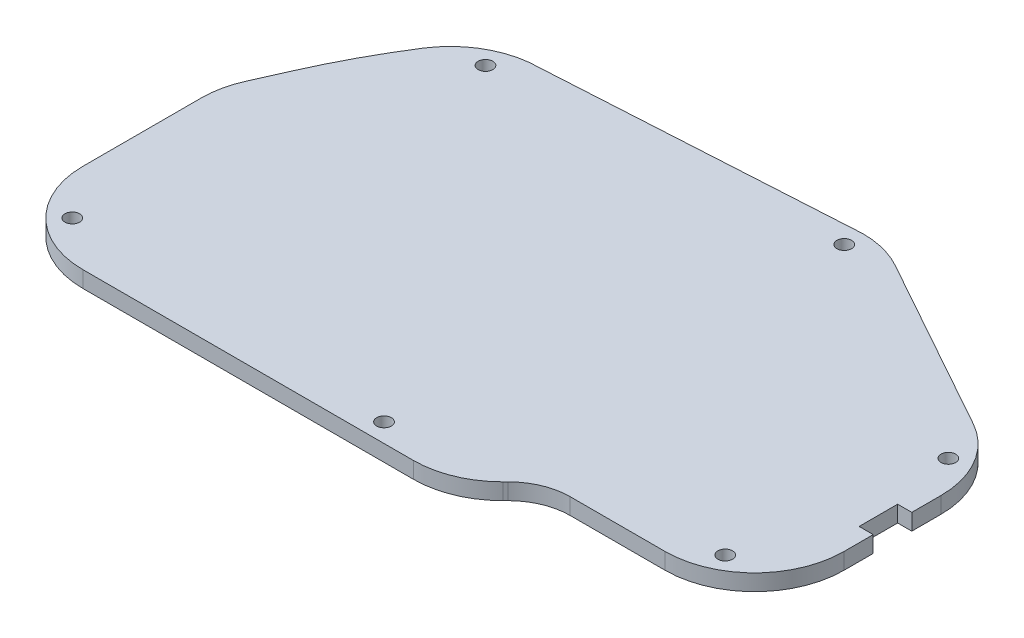
ISO-10303-21;
HEADER;
FILE_DESCRIPTION(('STEP AP214'),'2;1');
FILE_NAME('part.step','',(''),(''),'','','');
FILE_SCHEMA(('AUTOMOTIVE_DESIGN { 1 0 10303 214 1 1 1 1 }'));
ENDSEC;
DATA;
#1=APPLICATION_CONTEXT('core data for automotive mechanical design processes');
#2=APPLICATION_PROTOCOL_DEFINITION('international standard','automotive_design',2000,#1);
#3=PRODUCT_CONTEXT('',#1,'mechanical');
#4=PRODUCT('Part','Part','',(#3));
#5=PRODUCT_RELATED_PRODUCT_CATEGORY('part','',(#4));
#6=PRODUCT_DEFINITION_FORMATION('','',#4);
#7=PRODUCT_DEFINITION_CONTEXT('part definition',#1,'design');
#8=PRODUCT_DEFINITION('design','',#6,#7);
#9=PRODUCT_DEFINITION_SHAPE('','',#8);
#10=(LENGTH_UNIT() NAMED_UNIT(*) SI_UNIT(.MILLI.,.METRE.));
#11=(NAMED_UNIT(*) PLANE_ANGLE_UNIT() SI_UNIT($,.RADIAN.));
#12=(NAMED_UNIT(*) SI_UNIT($,.STERADIAN.) SOLID_ANGLE_UNIT());
#13=UNCERTAINTY_MEASURE_WITH_UNIT(LENGTH_MEASURE(1.E-05),#10,'distance_accuracy_value','');
#14=(GEOMETRIC_REPRESENTATION_CONTEXT(3) GLOBAL_UNCERTAINTY_ASSIGNED_CONTEXT((#13)) GLOBAL_UNIT_ASSIGNED_CONTEXT((#10,
#11,#12)) REPRESENTATION_CONTEXT('',''));
#15=CARTESIAN_POINT('',(0.,0.,0.));
#16=DIRECTION('',(0.,0.,1.));
#17=DIRECTION('',(1.,0.,0.));
#18=AXIS2_PLACEMENT_3D('',#15,#16,#17);
#19=CARTESIAN_POINT('',(-153.649556898131,3.175,60.0820712296482));
#20=DIRECTION('',(0.,1.,0.));
#21=DIRECTION('',(0.,0.,1.));
#22=AXIS2_PLACEMENT_3D('',#19,#20,#21);
#23=PLANE('',#22);
#24=CARTESIAN_POINT('',(-267.548354841244,3.175,97.8527285220219));
#25=DIRECTION('',(0.,1.,0.));
#26=DIRECTION('',(0.,0.,1.));
#27=AXIS2_PLACEMENT_3D('',#24,#25,#26);
#28=CIRCLE('',#27,1.42499999999999);
#29=CARTESIAN_POINT('',(-267.548354841244,3.175,99.2777285220219));
#30=VERTEX_POINT('',#29);
#31=EDGE_CURVE('E418',#30,#30,#28,.T.);
#32=ORIENTED_EDGE('',*,*,#31,.F.);
#33=EDGE_LOOP('',(#32));
#34=FACE_BOUND('',#33,.T.);
#35=CARTESIAN_POINT('',(-187.963906245359,3.175,27.219493821026));
#36=DIRECTION('',(0.,1.,0.));
#37=DIRECTION('',(0.,0.,1.));
#38=AXIS2_PLACEMENT_3D('',#35,#36,#37);
#39=CIRCLE('',#38,1.42500000000002);
#40=CARTESIAN_POINT('',(-187.963906245359,3.175,28.644493821026));
#41=VERTEX_POINT('',#40);
#42=EDGE_CURVE('E430',#41,#41,#39,.T.);
#43=ORIENTED_EDGE('',*,*,#42,.F.);
#44=EDGE_LOOP('',(#43));
#45=FACE_BOUND('',#44,.T.);
#46=CARTESIAN_POINT('',(-147.207602144608,3.175,91.1272884977668));
#47=DIRECTION('',(0.,1.,0.));
#48=DIRECTION('',(0.,0.,1.));
#49=AXIS2_PLACEMENT_3D('',#46,#47,#48);
#50=CIRCLE('',#49,1.42500000000002);
#51=CARTESIAN_POINT('',(-147.207602144608,3.175,92.5522884977668));
#52=VERTEX_POINT('',#51);
#53=EDGE_CURVE('E214',#52,#52,#50,.T.);
#54=ORIENTED_EDGE('',*,*,#53,.F.);
#55=EDGE_LOOP('',(#54));
#56=FACE_BOUND('',#55,.T.);
#57=CARTESIAN_POINT('',(-153.649556898131,3.175,60.0820712296482));
#58=DIRECTION('',(0.,1.,0.));
#59=DIRECTION('',(0.,0.,1.));
#60=AXIS2_PLACEMENT_3D('',#57,#58,#59);
#61=CIRCLE('',#60,17.3999999999996);
#62=CARTESIAN_POINT('',(-136.249556898132,3.175,60.0820712296497));
#63=VERTEX_POINT('',#62);
#64=CARTESIAN_POINT('',(-145.182770750242,3.175,44.8809682326312));
#65=VERTEX_POINT('',#64);
#66=EDGE_CURVE('E251',#63,#65,#61,.T.);
#67=ORIENTED_EDGE('',*,*,#66,.T.);
#68=DIRECTION('',(-0.873626609023966,0.,-0.486596905051077));
#69=VECTOR('',#68,1.);
#70=CARTESIAN_POINT('',(-145.182770750242,3.175,44.8809682326312));
#71=LINE('',#70,#69);
#72=CARTESIAN_POINT('',(-179.49712009747,3.175,25.768390824009));
#73=VERTEX_POINT('',#72);
#74=EDGE_CURVE('E134',#65,#73,#71,.T.);
#75=ORIENTED_EDGE('',*,*,#74,.T.);
#76=CARTESIAN_POINT('',(-187.963906245359,3.175,40.9694938210259));
#77=DIRECTION('',(0.,1.,0.));
#78=DIRECTION('',(0.,0.,1.));
#79=AXIS2_PLACEMENT_3D('',#76,#77,#78);
#80=CIRCLE('',#79,17.4);
#81=CARTESIAN_POINT('',(-187.960968922476,3.175,23.5694940689531));
#82=VERTEX_POINT('',#81);
#83=EDGE_CURVE('E305',#73,#82,#80,.T.);
#84=ORIENTED_EDGE('',*,*,#83,.T.);
#85=DIRECTION('',(-0.99827097221074,0.,0.058779809811052));
#86=VECTOR('',#85,1.);
#87=CARTESIAN_POINT('',(-187.960968922476,3.175,23.5694940689531));
#88=LINE('',#87,#86);
#89=CARTESIAN_POINT('',(-247.377604545257,3.175,27.0680416965429));
#90=VERTEX_POINT('',#89);
#91=EDGE_CURVE('E324',#82,#90,#88,.T.);
#92=ORIENTED_EDGE('',*,*,#91,.T.);
#93=CARTESIAN_POINT('',(-247.380541868139,3.175,44.4680414486157));
#94=DIRECTION('',(0.,1.,0.));
#95=DIRECTION('',(0.,0.,1.));
#96=AXIS2_PLACEMENT_3D('',#93,#94,#95);
#97=CIRCLE('',#96,17.4);
#98=CARTESIAN_POINT('',(-262.070326039549,3.175,35.1422577819519));
#99=VERTEX_POINT('',#98);
#100=EDGE_CURVE('E321',#90,#99,#97,.T.);
#101=ORIENTED_EDGE('',*,*,#100,.T.);
#102=CARTESIAN_POINT('',(-154.715336031883,3.175,103.29638453195));
#103=DIRECTION('',(0.,1.,0.));
#104=DIRECTION('',(0.,0.,1.));
#105=AXIS2_PLACEMENT_3D('',#102,#103,#104);
#106=CIRCLE('',#105,127.161624999844);
#107=CARTESIAN_POINT('',(-270.933745897009,3.175,51.6886323911874));
#108=VERTEX_POINT('',#107);
#109=EDGE_CURVE('E323',#99,#108,#106,.T.);
#110=ORIENTED_EDGE('',*,*,#109,.T.);
#111=DIRECTION('',(-0.405843760968183,0.,0.913942471758043));
#112=VECTOR('',#111,1.);
#113=CARTESIAN_POINT('',(-270.933745897009,3.175,51.6886323911874));
#114=LINE('',#113,#112);
#115=CARTESIAN_POINT('',(-273.728235608519,3.175,57.9817014977483));
#116=VERTEX_POINT('',#115);
#117=EDGE_CURVE('E326',#108,#116,#114,.T.);
#118=ORIENTED_EDGE('',*,*,#117,.T.);
#119=CARTESIAN_POINT('',(-257.825636599929,3.175,65.0433829385948));
#120=DIRECTION('',(0.,1.,0.));
#121=DIRECTION('',(0.,0.,1.));
#122=AXIS2_PLACEMENT_3D('',#119,#120,#121);
#123=CIRCLE('',#122,17.4);
#124=CARTESIAN_POINT('',(-275.225636599929,3.175,65.0433829385949));
#125=VERTEX_POINT('',#124);
#126=EDGE_CURVE('E332',#116,#125,#123,.T.);
#127=ORIENTED_EDGE('',*,*,#126,.T.);
#128=DIRECTION('',(0.,0.,1.));
#129=VECTOR('',#128,1.);
#130=CARTESIAN_POINT('',(-275.225636599929,3.175,65.0433829385949));
#131=LINE('',#130,#129);
#132=CARTESIAN_POINT('',(-275.225636599929,3.175,88.1300102807068));
#133=VERTEX_POINT('',#132);
#134=EDGE_CURVE('E334',#125,#133,#131,.T.);
#135=ORIENTED_EDGE('',*,*,#134,.T.);
#136=CARTESIAN_POINT('',(-257.825636599929,3.175,88.130010280707));
#137=DIRECTION('',(0.,1.,0.));
#138=DIRECTION('',(0.,0.,1.));
#139=AXIS2_PLACEMENT_3D('',#136,#137,#138);
#140=CIRCLE('',#139,17.4);
#141=CARTESIAN_POINT('',(-257.825636599929,3.175,105.530010280707));
#142=VERTEX_POINT('',#141);
#143=EDGE_CURVE('E336',#133,#142,#140,.T.);
#144=ORIENTED_EDGE('',*,*,#143,.T.);
#145=DIRECTION('',(1.,0.,0.));
#146=VECTOR('',#145,1.);
#147=CARTESIAN_POINT('',(-257.825636599926,3.175,105.530010280707));
#148=LINE('',#147,#146);
#149=CARTESIAN_POINT('',(-193.494425739186,3.175,105.530010280707));
#150=VERTEX_POINT('',#149);
#151=EDGE_CURVE('E338',#142,#150,#148,.T.);
#152=ORIENTED_EDGE('',*,*,#151,.T.);
#153=CARTESIAN_POINT('',(-193.494425739186,3.175,88.130010280707));
#154=DIRECTION('',(0.,1.,0.));
#155=DIRECTION('',(0.,0.,1.));
#156=AXIS2_PLACEMENT_3D('',#153,#154,#155);
#157=CIRCLE('',#156,17.4);
#158=CARTESIAN_POINT('',(-181.19076774654,3.175,100.433668273353));
#159=VERTEX_POINT('',#158);
#160=EDGE_CURVE('E340',#150,#159,#157,.T.);
#161=ORIENTED_EDGE('',*,*,#160,.T.);
#162=DIRECTION('',(0.707106781186557,0.,-0.707106781186538));
#163=VECTOR('',#162,1.);
#164=CARTESIAN_POINT('',(-181.19076774654,3.175,100.433668273353));
#165=LINE('',#164,#163);
#166=CARTESIAN_POINT('',(-180.680815132551,3.175,99.9237156593637));
#167=VERTEX_POINT('',#166);
#168=EDGE_CURVE('E342',#159,#167,#165,.T.);
#169=ORIENTED_EDGE('',*,*,#168,.T.);
#170=CARTESIAN_POINT('',(-172.124823080193,3.175,108.479707711721));
#171=DIRECTION('',(0.,-1.,0.));
#172=DIRECTION('',(0.,0.,1.));
#173=AXIS2_PLACEMENT_3D('',#170,#171,#172);
#174=CIRCLE('',#173,12.1);
#175=CARTESIAN_POINT('',(-172.124823080193,3.175,96.3797077117209));
#176=VERTEX_POINT('',#175);
#177=EDGE_CURVE('E344',#167,#176,#174,.T.);
#178=ORIENTED_EDGE('',*,*,#177,.T.);
#179=DIRECTION('',(1.,0.,0.));
#180=VECTOR('',#179,1.);
#181=CARTESIAN_POINT('',(-172.124823080193,3.175,96.3797077117209));
#182=LINE('',#181,#180);
#183=CARTESIAN_POINT('',(-153.649556898133,3.175,96.3797077117209));
#184=VERTEX_POINT('',#183);
#185=EDGE_CURVE('E346',#176,#184,#182,.T.);
#186=ORIENTED_EDGE('',*,*,#185,.T.);
#187=CARTESIAN_POINT('',(-153.649556898131,3.175,78.9797077117209));
#188=DIRECTION('',(0.,1.,0.));
#189=DIRECTION('',(0.,0.,1.));
#190=AXIS2_PLACEMENT_3D('',#187,#188,#189);
#191=CIRCLE('',#190,17.3999999999998);
#192=CARTESIAN_POINT('',(-136.249556898131,3.175,78.9797077117217));
#193=VERTEX_POINT('',#192);
#194=EDGE_CURVE('E348',#184,#193,#191,.T.);
#195=ORIENTED_EDGE('',*,*,#194,.T.);
#196=DIRECTION('',(0.,0.,-1.));
#197=VECTOR('',#196,1.);
#198=CARTESIAN_POINT('',(-136.249556898131,3.175,78.9797077117217));
#199=LINE('',#198,#197);
#200=CARTESIAN_POINT('',(-136.249556898131,3.175,73.2808894706851));
#201=VERTEX_POINT('',#200);
#202=EDGE_CURVE('E350',#193,#201,#199,.T.);
#203=ORIENTED_EDGE('',*,*,#202,.T.);
#204=DIRECTION('',(-1.,0.,0.));
#205=VECTOR('',#204,1.);
#206=CARTESIAN_POINT('',(-138.999556898131,3.175,73.2808894706851));
#207=LINE('',#206,#205);
#208=CARTESIAN_POINT('',(-138.999556898131,3.175,73.2808894706851));
#209=VERTEX_POINT('',#208);
#210=EDGE_CURVE('E192',#201,#209,#207,.T.);
#211=ORIENTED_EDGE('',*,*,#210,.T.);
#212=DIRECTION('',(0.,0.,-1.));
#213=VECTOR('',#212,1.);
#214=CARTESIAN_POINT('',(-138.999556898131,3.175,65.7808894706851));
#215=LINE('',#214,#213);
#216=CARTESIAN_POINT('',(-138.999556898131,3.175,65.7808894706851));
#217=VERTEX_POINT('',#216);
#218=EDGE_CURVE('E186',#209,#217,#215,.T.);
#219=ORIENTED_EDGE('',*,*,#218,.T.);
#220=DIRECTION('',(1.,0.,0.));
#221=VECTOR('',#220,1.);
#222=CARTESIAN_POINT('',(-138.999556898131,3.175,65.7808894706851));
#223=LINE('',#222,#221);
#224=CARTESIAN_POINT('',(-136.249556898131,3.175,65.7808894706851));
#225=VERTEX_POINT('',#224);
#226=EDGE_CURVE('E190',#217,#225,#223,.T.);
#227=ORIENTED_EDGE('',*,*,#226,.T.);
#228=DIRECTION('',(0.,0.,-1.));
#229=VECTOR('',#228,1.);
#230=CARTESIAN_POINT('',(-136.249556898131,3.175,65.7808894706851));
#231=LINE('',#230,#229);
#232=EDGE_CURVE('E52',#225,#63,#231,.T.);
#233=ORIENTED_EDGE('',*,*,#232,.T.);
#234=EDGE_LOOP('',(#67,#75,#84,#92,#101,#110,#118,#127,#135,#144,#152,#161,#169,#178,#186,#195,
#203,#211,#219,#227,#233));
#235=FACE_BOUND('',#234,.T.);
#236=CARTESIAN_POINT('',(-141.795027650598,3.175,53.1155343339314));
#237=DIRECTION('',(0.,1.,0.));
#238=DIRECTION('',(0.,0.,1.));
#239=AXIS2_PLACEMENT_3D('',#236,#237,#238);
#240=CIRCLE('',#239,1.42500000000002);
#241=CARTESIAN_POINT('',(-141.795027650598,3.175,54.5405343339314));
#242=VERTEX_POINT('',#241);
#243=EDGE_CURVE('E436',#242,#242,#240,.T.);
#244=ORIENTED_EDGE('',*,*,#243,.F.);
#245=EDGE_LOOP('',(#244));
#246=FACE_BOUND('',#245,.T.);
#247=CARTESIAN_POINT('',(-253.051529835332,3.175,31.9419728125291));
#248=DIRECTION('',(0.,1.,0.));
#249=DIRECTION('',(0.,0.,1.));
#250=AXIS2_PLACEMENT_3D('',#247,#248,#249);
#251=CIRCLE('',#250,1.42499999999999);
#252=CARTESIAN_POINT('',(-253.051529835332,3.175,33.3669728125291));
#253=VERTEX_POINT('',#252);
#254=EDGE_CURVE('E424',#253,#253,#251,.T.);
#255=ORIENTED_EDGE('',*,*,#254,.F.);
#256=EDGE_LOOP('',(#255));
#257=FACE_BOUND('',#256,.T.);
#258=CARTESIAN_POINT('',(-202.85468143992,3.175,101.880010280707));
#259=DIRECTION('',(0.,1.,0.));
#260=DIRECTION('',(0.,0.,1.));
#261=AXIS2_PLACEMENT_3D('',#258,#259,#260);
#262=CIRCLE('',#261,1.42500000000002);
#263=CARTESIAN_POINT('',(-202.85468143992,3.175,103.305010280707));
#264=VERTEX_POINT('',#263);
#265=EDGE_CURVE('E409',#264,#264,#262,.T.);
#266=ORIENTED_EDGE('',*,*,#265,.F.);
#267=EDGE_LOOP('',(#266));
#268=FACE_BOUND('',#267,.T.);
#269=ADVANCED_FACE('F35',(#34,#45,#56,#235,#246,#257,#268),#23,.T.);
#270=CARTESIAN_POINT('',(-153.649556898131,0.,60.0820712296482));
#271=DIRECTION('',(0.,1.,0.));
#272=DIRECTION('',(0.,0.,1.));
#273=AXIS2_PLACEMENT_3D('',#270,#271,#272);
#274=PLANE('',#273);
#275=CARTESIAN_POINT('',(-153.649556898131,0.,60.0820712296482));
#276=DIRECTION('',(0.,1.,0.));
#277=DIRECTION('',(0.,0.,1.));
#278=AXIS2_PLACEMENT_3D('',#275,#276,#277);
#279=CIRCLE('',#278,17.3999999999996);
#280=CARTESIAN_POINT('',(-136.249556898132,0.,60.0820712296497));
#281=VERTEX_POINT('',#280);
#282=CARTESIAN_POINT('',(-145.182770750242,0.,44.8809682326312));
#283=VERTEX_POINT('',#282);
#284=EDGE_CURVE('E210',#281,#283,#279,.T.);
#285=ORIENTED_EDGE('',*,*,#284,.F.);
#286=DIRECTION('',(0.,0.,-1.));
#287=VECTOR('',#286,1.);
#288=CARTESIAN_POINT('',(-136.249556898131,0.,65.7808894706851));
#289=LINE('',#288,#287);
#290=CARTESIAN_POINT('',(-136.249556898131,0.,65.7808894706851));
#291=VERTEX_POINT('',#290);
#292=EDGE_CURVE('E126',#291,#281,#289,.T.);
#293=ORIENTED_EDGE('',*,*,#292,.F.);
#294=DIRECTION('',(1.,0.,0.));
#295=VECTOR('',#294,1.);
#296=CARTESIAN_POINT('',(-138.999556898131,0.,65.7808894706851));
#297=LINE('',#296,#295);
#298=CARTESIAN_POINT('',(-138.999556898131,0.,65.7808894706851));
#299=VERTEX_POINT('',#298);
#300=EDGE_CURVE('E120',#299,#291,#297,.T.);
#301=ORIENTED_EDGE('',*,*,#300,.F.);
#302=DIRECTION('',(0.,0.,-1.));
#303=VECTOR('',#302,1.);
#304=CARTESIAN_POINT('',(-138.999556898131,0.,65.7808894706851));
#305=LINE('',#304,#303);
#306=CARTESIAN_POINT('',(-138.999556898131,0.,73.2808894706851));
#307=VERTEX_POINT('',#306);
#308=EDGE_CURVE('E200',#307,#299,#305,.T.);
#309=ORIENTED_EDGE('',*,*,#308,.F.);
#310=DIRECTION('',(-1.,0.,0.));
#311=VECTOR('',#310,1.);
#312=CARTESIAN_POINT('',(-138.999556898131,0.,73.2808894706851));
#313=LINE('',#312,#311);
#314=CARTESIAN_POINT('',(-136.249556898131,0.,73.2808894706851));
#315=VERTEX_POINT('',#314);
#316=EDGE_CURVE('E246',#315,#307,#313,.T.);
#317=ORIENTED_EDGE('',*,*,#316,.F.);
#318=DIRECTION('',(0.,0.,-1.));
#319=VECTOR('',#318,1.);
#320=CARTESIAN_POINT('',(-136.249556898131,0.,78.9797077117217));
#321=LINE('',#320,#319);
#322=CARTESIAN_POINT('',(-136.249556898131,0.,78.9797077117217));
#323=VERTEX_POINT('',#322);
#324=EDGE_CURVE('E244',#323,#315,#321,.T.);
#325=ORIENTED_EDGE('',*,*,#324,.F.);
#326=CARTESIAN_POINT('',(-153.649556898131,0.,78.9797077117209));
#327=DIRECTION('',(0.,1.,0.));
#328=DIRECTION('',(0.,0.,1.));
#329=AXIS2_PLACEMENT_3D('',#326,#327,#328);
#330=CIRCLE('',#329,17.3999999999998);
#331=CARTESIAN_POINT('',(-153.649556898133,0.,96.3797077117209));
#332=VERTEX_POINT('',#331);
#333=EDGE_CURVE('E242',#332,#323,#330,.T.);
#334=ORIENTED_EDGE('',*,*,#333,.F.);
#335=DIRECTION('',(1.,0.,0.));
#336=VECTOR('',#335,1.);
#337=CARTESIAN_POINT('',(-172.124823080193,0.,96.3797077117209));
#338=LINE('',#337,#336);
#339=CARTESIAN_POINT('',(-172.124823080193,0.,96.3797077117209));
#340=VERTEX_POINT('',#339);
#341=EDGE_CURVE('E240',#340,#332,#338,.T.);
#342=ORIENTED_EDGE('',*,*,#341,.F.);
#343=CARTESIAN_POINT('',(-172.124823080193,0.,108.479707711721));
#344=DIRECTION('',(0.,-1.,0.));
#345=DIRECTION('',(0.,0.,1.));
#346=AXIS2_PLACEMENT_3D('',#343,#344,#345);
#347=CIRCLE('',#346,12.1);
#348=CARTESIAN_POINT('',(-180.680815132551,0.,99.9237156593637));
#349=VERTEX_POINT('',#348);
#350=EDGE_CURVE('E238',#349,#340,#347,.T.);
#351=ORIENTED_EDGE('',*,*,#350,.F.);
#352=DIRECTION('',(0.707106781186557,0.,-0.707106781186538));
#353=VECTOR('',#352,1.);
#354=CARTESIAN_POINT('',(-181.19076774654,0.,100.433668273353));
#355=LINE('',#354,#353);
#356=CARTESIAN_POINT('',(-181.19076774654,0.,100.433668273353));
#357=VERTEX_POINT('',#356);
#358=EDGE_CURVE('E236',#357,#349,#355,.T.);
#359=ORIENTED_EDGE('',*,*,#358,.F.);
#360=CARTESIAN_POINT('',(-193.494425739186,0.,88.130010280707));
#361=DIRECTION('',(0.,1.,0.));
#362=DIRECTION('',(0.,0.,1.));
#363=AXIS2_PLACEMENT_3D('',#360,#361,#362);
#364=CIRCLE('',#363,17.4);
#365=CARTESIAN_POINT('',(-193.494425739186,0.,105.530010280707));
#366=VERTEX_POINT('',#365);
#367=EDGE_CURVE('E234',#366,#357,#364,.T.);
#368=ORIENTED_EDGE('',*,*,#367,.F.);
#369=DIRECTION('',(1.,0.,0.));
#370=VECTOR('',#369,1.);
#371=CARTESIAN_POINT('',(-257.825636599926,0.,105.530010280707));
#372=LINE('',#371,#370);
#373=CARTESIAN_POINT('',(-257.825636599929,0.,105.530010280707));
#374=VERTEX_POINT('',#373);
#375=EDGE_CURVE('E232',#374,#366,#372,.T.);
#376=ORIENTED_EDGE('',*,*,#375,.F.);
#377=CARTESIAN_POINT('',(-257.825636599929,0.,88.130010280707));
#378=DIRECTION('',(0.,1.,0.));
#379=DIRECTION('',(0.,0.,1.));
#380=AXIS2_PLACEMENT_3D('',#377,#378,#379);
#381=CIRCLE('',#380,17.4);
#382=CARTESIAN_POINT('',(-275.225636599929,0.,88.1300102807068));
#383=VERTEX_POINT('',#382);
#384=EDGE_CURVE('E230',#383,#374,#381,.T.);
#385=ORIENTED_EDGE('',*,*,#384,.F.);
#386=DIRECTION('',(0.,0.,1.));
#387=VECTOR('',#386,1.);
#388=CARTESIAN_POINT('',(-275.225636599929,0.,65.0433829385949));
#389=LINE('',#388,#387);
#390=CARTESIAN_POINT('',(-275.225636599929,0.,65.0433829385949));
#391=VERTEX_POINT('',#390);
#392=EDGE_CURVE('E228',#391,#383,#389,.T.);
#393=ORIENTED_EDGE('',*,*,#392,.F.);
#394=CARTESIAN_POINT('',(-257.825636599929,0.,65.0433829385948));
#395=DIRECTION('',(0.,1.,0.));
#396=DIRECTION('',(0.,0.,1.));
#397=AXIS2_PLACEMENT_3D('',#394,#395,#396);
#398=CIRCLE('',#397,17.4);
#399=CARTESIAN_POINT('',(-273.728235608519,0.,57.9817014977483));
#400=VERTEX_POINT('',#399);
#401=EDGE_CURVE('E226',#400,#391,#398,.T.);
#402=ORIENTED_EDGE('',*,*,#401,.F.);
#403=DIRECTION('',(-0.405843760968183,0.,0.913942471758043));
#404=VECTOR('',#403,1.);
#405=CARTESIAN_POINT('',(-270.933745897009,0.,51.6886323911874));
#406=LINE('',#405,#404);
#407=CARTESIAN_POINT('',(-270.933745897009,0.,51.6886323911874));
#408=VERTEX_POINT('',#407);
#409=EDGE_CURVE('E224',#408,#400,#406,.T.);
#410=ORIENTED_EDGE('',*,*,#409,.F.);
#411=CARTESIAN_POINT('',(-154.715336031883,0.,103.29638453195));
#412=DIRECTION('',(0.,1.,0.));
#413=DIRECTION('',(0.,0.,1.));
#414=AXIS2_PLACEMENT_3D('',#411,#412,#413);
#415=CIRCLE('',#414,127.161624999844);
#416=CARTESIAN_POINT('',(-262.070326039549,0.,35.1422577819519));
#417=VERTEX_POINT('',#416);
#418=EDGE_CURVE('E222',#417,#408,#415,.T.);
#419=ORIENTED_EDGE('',*,*,#418,.F.);
#420=CARTESIAN_POINT('',(-247.380541868139,0.,44.4680414486157));
#421=DIRECTION('',(0.,1.,0.));
#422=DIRECTION('',(0.,0.,1.));
#423=AXIS2_PLACEMENT_3D('',#420,#421,#422);
#424=CIRCLE('',#423,17.4);
#425=CARTESIAN_POINT('',(-247.377604545257,0.,27.0680416965429));
#426=VERTEX_POINT('',#425);
#427=EDGE_CURVE('E220',#426,#417,#424,.T.);
#428=ORIENTED_EDGE('',*,*,#427,.F.);
#429=DIRECTION('',(-0.99827097221074,0.,0.058779809811052));
#430=VECTOR('',#429,1.);
#431=CARTESIAN_POINT('',(-187.960968922476,0.,23.5694940689531));
#432=LINE('',#431,#430);
#433=CARTESIAN_POINT('',(-187.960968922476,0.,23.5694940689531));
#434=VERTEX_POINT('',#433);
#435=EDGE_CURVE('E218',#434,#426,#432,.T.);
#436=ORIENTED_EDGE('',*,*,#435,.F.);
#437=CARTESIAN_POINT('',(-187.963906245359,0.,40.9694938210259));
#438=DIRECTION('',(0.,1.,0.));
#439=DIRECTION('',(0.,0.,1.));
#440=AXIS2_PLACEMENT_3D('',#437,#438,#439);
#441=CIRCLE('',#440,17.4);
#442=CARTESIAN_POINT('',(-179.49712009747,0.,25.768390824009));
#443=VERTEX_POINT('',#442);
#444=EDGE_CURVE('E216',#443,#434,#441,.T.);
#445=ORIENTED_EDGE('',*,*,#444,.F.);
#446=DIRECTION('',(-0.873626609023966,0.,-0.486596905051077));
#447=VECTOR('',#446,1.);
#448=CARTESIAN_POINT('',(-145.182770750242,0.,44.8809682326312));
#449=LINE('',#448,#447);
#450=EDGE_CURVE('E213',#283,#443,#449,.T.);
#451=ORIENTED_EDGE('',*,*,#450,.F.);
#452=EDGE_LOOP('',(#285,#293,#301,#309,#317,#325,#334,#342,#351,#359,#368,#376,#385,#393,#402,
#410,#419,#428,#436,#445,#451));
#453=FACE_BOUND('',#452,.T.);
#454=CARTESIAN_POINT('',(-147.207602144608,0.,91.1272884977668));
#455=DIRECTION('',(0.,1.,0.));
#456=DIRECTION('',(0.,0.,1.));
#457=AXIS2_PLACEMENT_3D('',#454,#455,#456);
#458=CIRCLE('',#457,1.42500000000002);
#459=CARTESIAN_POINT('',(-147.207602144608,0.,92.5522884977668));
#460=VERTEX_POINT('',#459);
#461=EDGE_CURVE('E439',#460,#460,#458,.T.);
#462=ORIENTED_EDGE('',*,*,#461,.T.);
#463=EDGE_LOOP('',(#462));
#464=FACE_BOUND('',#463,.T.);
#465=CARTESIAN_POINT('',(-141.795027650598,0.,53.1155343339314));
#466=DIRECTION('',(0.,1.,0.));
#467=DIRECTION('',(0.,0.,1.));
#468=AXIS2_PLACEMENT_3D('',#465,#466,#467);
#469=CIRCLE('',#468,1.42500000000002);
#470=CARTESIAN_POINT('',(-141.795027650598,0.,54.5405343339314));
#471=VERTEX_POINT('',#470);
#472=EDGE_CURVE('E433',#471,#471,#469,.T.);
#473=ORIENTED_EDGE('',*,*,#472,.T.);
#474=EDGE_LOOP('',(#473));
#475=FACE_BOUND('',#474,.T.);
#476=CARTESIAN_POINT('',(-187.963906245359,0.,27.219493821026));
#477=DIRECTION('',(0.,1.,0.));
#478=DIRECTION('',(0.,0.,1.));
#479=AXIS2_PLACEMENT_3D('',#476,#477,#478);
#480=CIRCLE('',#479,1.42500000000002);
#481=CARTESIAN_POINT('',(-187.963906245359,0.,28.644493821026));
#482=VERTEX_POINT('',#481);
#483=EDGE_CURVE('E427',#482,#482,#480,.T.);
#484=ORIENTED_EDGE('',*,*,#483,.T.);
#485=EDGE_LOOP('',(#484));
#486=FACE_BOUND('',#485,.T.);
#487=CARTESIAN_POINT('',(-253.051529835332,0.,31.9419728125291));
#488=DIRECTION('',(0.,1.,0.));
#489=DIRECTION('',(0.,0.,1.));
#490=AXIS2_PLACEMENT_3D('',#487,#488,#489);
#491=CIRCLE('',#490,1.42499999999999);
#492=CARTESIAN_POINT('',(-253.051529835332,0.,33.3669728125291));
#493=VERTEX_POINT('',#492);
#494=EDGE_CURVE('E421',#493,#493,#491,.T.);
#495=ORIENTED_EDGE('',*,*,#494,.T.);
#496=EDGE_LOOP('',(#495));
#497=FACE_BOUND('',#496,.T.);
#498=CARTESIAN_POINT('',(-267.548354841244,0.,97.8527285220219));
#499=DIRECTION('',(0.,1.,0.));
#500=DIRECTION('',(0.,0.,1.));
#501=AXIS2_PLACEMENT_3D('',#498,#499,#500);
#502=CIRCLE('',#501,1.42499999999999);
#503=CARTESIAN_POINT('',(-267.548354841244,0.,99.2777285220219));
#504=VERTEX_POINT('',#503);
#505=EDGE_CURVE('E415',#504,#504,#502,.T.);
#506=ORIENTED_EDGE('',*,*,#505,.T.);
#507=EDGE_LOOP('',(#506));
#508=FACE_BOUND('',#507,.T.);
#509=CARTESIAN_POINT('',(-202.85468143992,0.,101.880010280707));
#510=DIRECTION('',(0.,1.,0.));
#511=DIRECTION('',(0.,0.,1.));
#512=AXIS2_PLACEMENT_3D('',#509,#510,#511);
#513=CIRCLE('',#512,1.42500000000002);
#514=CARTESIAN_POINT('',(-202.85468143992,0.,103.305010280707));
#515=VERTEX_POINT('',#514);
#516=EDGE_CURVE('E412',#515,#515,#513,.T.);
#517=ORIENTED_EDGE('',*,*,#516,.T.);
#518=EDGE_LOOP('',(#517));
#519=FACE_BOUND('',#518,.T.);
#520=ADVANCED_FACE('F309',(#453,#464,#475,#486,#497,#508,#519),#274,.F.);
#521=CARTESIAN_POINT('',(-153.649556898131,3.175,60.0820712296482));
#522=DIRECTION('',(0.,-1.,0.));
#523=DIRECTION('',(0.,0.,-1.));
#524=AXIS2_PLACEMENT_3D('',#521,#522,#523);
#525=CYLINDRICAL_SURFACE('',#524,17.3999999999996);
#526=ORIENTED_EDGE('',*,*,#284,.T.);
#527=DIRECTION('',(0.,-1.,0.));
#528=VECTOR('',#527,1.);
#529=CARTESIAN_POINT('',(-145.182770750242,3.175,44.8809682326312));
#530=LINE('',#529,#528);
#531=EDGE_CURVE('E11',#65,#283,#530,.T.);
#532=ORIENTED_EDGE('',*,*,#531,.F.);
#533=ORIENTED_EDGE('',*,*,#66,.F.);
#534=DIRECTION('',(0.,-1.,0.));
#535=VECTOR('',#534,1.);
#536=CARTESIAN_POINT('',(-136.249556898132,3.175,60.0820712296497));
#537=LINE('',#536,#535);
#538=EDGE_CURVE('E206',#63,#281,#537,.T.);
#539=ORIENTED_EDGE('',*,*,#538,.T.);
#540=EDGE_LOOP('',(#526,#532,#533,#539));
#541=FACE_BOUND('',#540,.T.);
#542=ADVANCED_FACE('F37',(#541),#525,.T.);
#543=CARTESIAN_POINT('',(-145.182770750242,3.175,44.8809682326312));
#544=DIRECTION('',(-0.486596905051077,0.,0.873626609023966));
#545=DIRECTION('',(0.873626609023966,0.,0.486596905051077));
#546=AXIS2_PLACEMENT_3D('',#543,#544,#545);
#547=PLANE('',#546);
#548=ORIENTED_EDGE('',*,*,#450,.T.);
#549=DIRECTION('',(0.,-1.,0.));
#550=VECTOR('',#549,1.);
#551=CARTESIAN_POINT('',(-179.49712009747,3.175,25.768390824009));
#552=LINE('',#551,#550);
#553=EDGE_CURVE('E44',#73,#443,#552,.T.);
#554=ORIENTED_EDGE('',*,*,#553,.F.);
#555=ORIENTED_EDGE('',*,*,#74,.F.);
#556=ORIENTED_EDGE('',*,*,#531,.T.);
#557=EDGE_LOOP('',(#548,#554,#555,#556));
#558=FACE_BOUND('',#557,.T.);
#559=ADVANCED_FACE('F657',(#558),#547,.F.);
#560=CARTESIAN_POINT('',(-187.963906245359,3.175,40.9694938210259));
#561=DIRECTION('',(0.,-1.,0.));
#562=DIRECTION('',(0.,0.,-1.));
#563=AXIS2_PLACEMENT_3D('',#560,#561,#562);
#564=CYLINDRICAL_SURFACE('',#563,17.4);
#565=ORIENTED_EDGE('',*,*,#444,.T.);
#566=DIRECTION('',(0.,-1.,0.));
#567=VECTOR('',#566,1.);
#568=CARTESIAN_POINT('',(-187.960968922476,3.175,23.5694940689531));
#569=LINE('',#568,#567);
#570=EDGE_CURVE('E297',#82,#434,#569,.T.);
#571=ORIENTED_EDGE('',*,*,#570,.F.);
#572=ORIENTED_EDGE('',*,*,#83,.F.);
#573=ORIENTED_EDGE('',*,*,#553,.T.);
#574=EDGE_LOOP('',(#565,#571,#572,#573));
#575=FACE_BOUND('',#574,.T.);
#576=ADVANCED_FACE('F303',(#575),#564,.T.);
#577=CARTESIAN_POINT('',(-187.960968922476,3.175,23.5694940689531));
#578=DIRECTION('',(0.058779809811052,0.,0.99827097221074));
#579=DIRECTION('',(0.99827097221074,0.,-0.058779809811052));
#580=AXIS2_PLACEMENT_3D('',#577,#578,#579);
#581=PLANE('',#580);
#582=ORIENTED_EDGE('',*,*,#435,.T.);
#583=DIRECTION('',(0.,-1.,0.));
#584=VECTOR('',#583,1.);
#585=CARTESIAN_POINT('',(-247.377604545257,3.175,27.0680416965429));
#586=LINE('',#585,#584);
#587=EDGE_CURVE('E294',#90,#426,#586,.T.);
#588=ORIENTED_EDGE('',*,*,#587,.F.);
#589=ORIENTED_EDGE('',*,*,#91,.F.);
#590=ORIENTED_EDGE('',*,*,#570,.T.);
#591=EDGE_LOOP('',(#582,#588,#589,#590));
#592=FACE_BOUND('',#591,.T.);
#593=ADVANCED_FACE('F315',(#592),#581,.F.);
#594=CARTESIAN_POINT('',(-247.380541868139,3.175,44.4680414486157));
#595=DIRECTION('',(0.,-1.,0.));
#596=DIRECTION('',(0.,0.,-1.));
#597=AXIS2_PLACEMENT_3D('',#594,#595,#596);
#598=CYLINDRICAL_SURFACE('',#597,17.4);
#599=ORIENTED_EDGE('',*,*,#427,.T.);
#600=DIRECTION('',(0.,-1.,0.));
#601=VECTOR('',#600,1.);
#602=CARTESIAN_POINT('',(-262.070326039549,3.175,35.1422577819519));
#603=LINE('',#602,#601);
#604=EDGE_CURVE('E291',#99,#417,#603,.T.);
#605=ORIENTED_EDGE('',*,*,#604,.F.);
#606=ORIENTED_EDGE('',*,*,#100,.F.);
#607=ORIENTED_EDGE('',*,*,#587,.T.);
#608=EDGE_LOOP('',(#599,#605,#606,#607));
#609=FACE_BOUND('',#608,.T.);
#610=ADVANCED_FACE('F319',(#609),#598,.T.);
#611=CARTESIAN_POINT('',(-154.715336031883,3.175,103.29638453195));
#612=DIRECTION('',(0.,-1.,0.));
#613=DIRECTION('',(0.,0.,-1.));
#614=AXIS2_PLACEMENT_3D('',#611,#612,#613);
#615=CYLINDRICAL_SURFACE('',#614,127.161624999844);
#616=ORIENTED_EDGE('',*,*,#418,.T.);
#617=DIRECTION('',(0.,-1.,0.));
#618=VECTOR('',#617,1.);
#619=CARTESIAN_POINT('',(-270.933745897009,3.175,51.6886323911874));
#620=LINE('',#619,#618);
#621=EDGE_CURVE('E288',#108,#408,#620,.T.);
#622=ORIENTED_EDGE('',*,*,#621,.F.);
#623=ORIENTED_EDGE('',*,*,#109,.F.);
#624=ORIENTED_EDGE('',*,*,#604,.T.);
#625=EDGE_LOOP('',(#616,#622,#623,#624));
#626=FACE_BOUND('',#625,.T.);
#627=ADVANCED_FACE('F622',(#626),#615,.T.);
#628=CARTESIAN_POINT('',(-270.933745897009,3.175,51.6886323911874));
#629=DIRECTION('',(0.913942471758043,0.,0.405843760968183));
#630=DIRECTION('',(0.405843760968183,0.,-0.913942471758043));
#631=AXIS2_PLACEMENT_3D('',#628,#629,#630);
#632=PLANE('',#631);
#633=ORIENTED_EDGE('',*,*,#409,.T.);
#634=DIRECTION('',(0.,-1.,0.));
#635=VECTOR('',#634,1.);
#636=CARTESIAN_POINT('',(-273.728235608519,3.175,57.9817014977483));
#637=LINE('',#636,#635);
#638=EDGE_CURVE('E285',#116,#400,#637,.T.);
#639=ORIENTED_EDGE('',*,*,#638,.F.);
#640=ORIENTED_EDGE('',*,*,#117,.F.);
#641=ORIENTED_EDGE('',*,*,#621,.T.);
#642=EDGE_LOOP('',(#633,#639,#640,#641));
#643=FACE_BOUND('',#642,.T.);
#644=ADVANCED_FACE('F612',(#643),#632,.F.);
#645=CARTESIAN_POINT('',(-257.825636599929,3.175,65.0433829385948));
#646=DIRECTION('',(0.,-1.,0.));
#647=DIRECTION('',(0.,0.,-1.));
#648=AXIS2_PLACEMENT_3D('',#645,#646,#647);
#649=CYLINDRICAL_SURFACE('',#648,17.4);
#650=ORIENTED_EDGE('',*,*,#401,.T.);
#651=DIRECTION('',(0.,-1.,0.));
#652=VECTOR('',#651,1.);
#653=CARTESIAN_POINT('',(-275.225636599929,3.175,65.0433829385949));
#654=LINE('',#653,#652);
#655=EDGE_CURVE('E282',#125,#391,#654,.T.);
#656=ORIENTED_EDGE('',*,*,#655,.F.);
#657=ORIENTED_EDGE('',*,*,#126,.F.);
#658=ORIENTED_EDGE('',*,*,#638,.T.);
#659=EDGE_LOOP('',(#650,#656,#657,#658));
#660=FACE_BOUND('',#659,.T.);
#661=ADVANCED_FACE('F602',(#660),#649,.T.);
#662=CARTESIAN_POINT('',(-275.225636599929,3.175,65.0433829385949));
#663=DIRECTION('',(1.,0.,0.));
#664=DIRECTION('',(0.,0.,-1.));
#665=AXIS2_PLACEMENT_3D('',#662,#663,#664);
#666=PLANE('',#665);
#667=ORIENTED_EDGE('',*,*,#392,.T.);
#668=DIRECTION('',(0.,-1.,0.));
#669=VECTOR('',#668,1.);
#670=CARTESIAN_POINT('',(-275.225636599929,3.175,88.1300102807068));
#671=LINE('',#670,#669);
#672=EDGE_CURVE('E279',#133,#383,#671,.T.);
#673=ORIENTED_EDGE('',*,*,#672,.F.);
#674=ORIENTED_EDGE('',*,*,#134,.F.);
#675=ORIENTED_EDGE('',*,*,#655,.T.);
#676=EDGE_LOOP('',(#667,#673,#674,#675));
#677=FACE_BOUND('',#676,.T.);
#678=ADVANCED_FACE('F592',(#677),#666,.F.);
#679=CARTESIAN_POINT('',(-257.825636599929,3.175,88.130010280707));
#680=DIRECTION('',(0.,-1.,0.));
#681=DIRECTION('',(0.,0.,-1.));
#682=AXIS2_PLACEMENT_3D('',#679,#680,#681);
#683=CYLINDRICAL_SURFACE('',#682,17.4);
#684=ORIENTED_EDGE('',*,*,#384,.T.);
#685=DIRECTION('',(0.,-1.,0.));
#686=VECTOR('',#685,1.);
#687=CARTESIAN_POINT('',(-257.825636599929,3.175,105.530010280707));
#688=LINE('',#687,#686);
#689=EDGE_CURVE('E276',#142,#374,#688,.T.);
#690=ORIENTED_EDGE('',*,*,#689,.F.);
#691=ORIENTED_EDGE('',*,*,#143,.F.);
#692=ORIENTED_EDGE('',*,*,#672,.T.);
#693=EDGE_LOOP('',(#684,#690,#691,#692));
#694=FACE_BOUND('',#693,.T.);
#695=ADVANCED_FACE('F582',(#694),#683,.T.);
#696=CARTESIAN_POINT('',(-257.825636599926,3.175,105.530010280707));
#697=DIRECTION('',(0.,0.,-1.));
#698=DIRECTION('',(-1.,0.,0.));
#699=AXIS2_PLACEMENT_3D('',#696,#697,#698);
#700=PLANE('',#699);
#701=ORIENTED_EDGE('',*,*,#375,.T.);
#702=DIRECTION('',(0.,-1.,0.));
#703=VECTOR('',#702,1.);
#704=CARTESIAN_POINT('',(-193.494425739186,3.175,105.530010280707));
#705=LINE('',#704,#703);
#706=EDGE_CURVE('E273',#150,#366,#705,.T.);
#707=ORIENTED_EDGE('',*,*,#706,.F.);
#708=ORIENTED_EDGE('',*,*,#151,.F.);
#709=ORIENTED_EDGE('',*,*,#689,.T.);
#710=EDGE_LOOP('',(#701,#707,#708,#709));
#711=FACE_BOUND('',#710,.T.);
#712=ADVANCED_FACE('F572',(#711),#700,.F.);
#713=CARTESIAN_POINT('',(-193.494425739186,3.175,88.130010280707));
#714=DIRECTION('',(0.,-1.,0.));
#715=DIRECTION('',(0.,0.,-1.));
#716=AXIS2_PLACEMENT_3D('',#713,#714,#715);
#717=CYLINDRICAL_SURFACE('',#716,17.4);
#718=ORIENTED_EDGE('',*,*,#367,.T.);
#719=DIRECTION('',(0.,-1.,0.));
#720=VECTOR('',#719,1.);
#721=CARTESIAN_POINT('',(-181.19076774654,3.175,100.433668273353));
#722=LINE('',#721,#720);
#723=EDGE_CURVE('E270',#159,#357,#722,.T.);
#724=ORIENTED_EDGE('',*,*,#723,.F.);
#725=ORIENTED_EDGE('',*,*,#160,.F.);
#726=ORIENTED_EDGE('',*,*,#706,.T.);
#727=EDGE_LOOP('',(#718,#724,#725,#726));
#728=FACE_BOUND('',#727,.T.);
#729=ADVANCED_FACE('F562',(#728),#717,.T.);
#730=CARTESIAN_POINT('',(-181.19076774654,3.175,100.433668273353));
#731=DIRECTION('',(-0.707106781186538,0.,-0.707106781186557));
#732=DIRECTION('',(-0.707106781186557,0.,0.707106781186538));
#733=AXIS2_PLACEMENT_3D('',#730,#731,#732);
#734=PLANE('',#733);
#735=ORIENTED_EDGE('',*,*,#358,.T.);
#736=DIRECTION('',(0.,-1.,0.));
#737=VECTOR('',#736,1.);
#738=CARTESIAN_POINT('',(-180.680815132551,3.175,99.9237156593637));
#739=LINE('',#738,#737);
#740=EDGE_CURVE('E267',#167,#349,#739,.T.);
#741=ORIENTED_EDGE('',*,*,#740,.F.);
#742=ORIENTED_EDGE('',*,*,#168,.F.);
#743=ORIENTED_EDGE('',*,*,#723,.T.);
#744=EDGE_LOOP('',(#735,#741,#742,#743));
#745=FACE_BOUND('',#744,.T.);
#746=ADVANCED_FACE('F552',(#745),#734,.F.);
#747=CARTESIAN_POINT('',(-172.124823080193,3.175,108.479707711721));
#748=DIRECTION('',(0.,-1.,0.));
#749=DIRECTION('',(0.,0.,-1.));
#750=AXIS2_PLACEMENT_3D('',#747,#748,#749);
#751=CYLINDRICAL_SURFACE('',#750,12.1);
#752=ORIENTED_EDGE('',*,*,#350,.T.);
#753=DIRECTION('',(0.,-1.,0.));
#754=VECTOR('',#753,1.);
#755=CARTESIAN_POINT('',(-172.124823080193,3.175,96.3797077117209));
#756=LINE('',#755,#754);
#757=EDGE_CURVE('E264',#176,#340,#756,.T.);
#758=ORIENTED_EDGE('',*,*,#757,.F.);
#759=ORIENTED_EDGE('',*,*,#177,.F.);
#760=ORIENTED_EDGE('',*,*,#740,.T.);
#761=EDGE_LOOP('',(#752,#758,#759,#760));
#762=FACE_BOUND('',#761,.T.);
#763=ADVANCED_FACE('F542',(#762),#751,.F.);
#764=CARTESIAN_POINT('',(-172.124823080193,3.175,96.3797077117209));
#765=DIRECTION('',(0.,0.,-1.));
#766=DIRECTION('',(-1.,0.,0.));
#767=AXIS2_PLACEMENT_3D('',#764,#765,#766);
#768=PLANE('',#767);
#769=ORIENTED_EDGE('',*,*,#341,.T.);
#770=DIRECTION('',(0.,-1.,0.));
#771=VECTOR('',#770,1.);
#772=CARTESIAN_POINT('',(-153.649556898133,3.175,96.3797077117209));
#773=LINE('',#772,#771);
#774=EDGE_CURVE('E261',#184,#332,#773,.T.);
#775=ORIENTED_EDGE('',*,*,#774,.F.);
#776=ORIENTED_EDGE('',*,*,#185,.F.);
#777=ORIENTED_EDGE('',*,*,#757,.T.);
#778=EDGE_LOOP('',(#769,#775,#776,#777));
#779=FACE_BOUND('',#778,.T.);
#780=ADVANCED_FACE('F532',(#779),#768,.F.);
#781=CARTESIAN_POINT('',(-153.649556898131,3.175,78.9797077117209));
#782=DIRECTION('',(0.,-1.,0.));
#783=DIRECTION('',(0.,0.,-1.));
#784=AXIS2_PLACEMENT_3D('',#781,#782,#783);
#785=CYLINDRICAL_SURFACE('',#784,17.3999999999998);
#786=ORIENTED_EDGE('',*,*,#333,.T.);
#787=DIRECTION('',(0.,-1.,0.));
#788=VECTOR('',#787,1.);
#789=CARTESIAN_POINT('',(-136.249556898131,3.175,78.9797077117217));
#790=LINE('',#789,#788);
#791=EDGE_CURVE('E258',#193,#323,#790,.T.);
#792=ORIENTED_EDGE('',*,*,#791,.F.);
#793=ORIENTED_EDGE('',*,*,#194,.F.);
#794=ORIENTED_EDGE('',*,*,#774,.T.);
#795=EDGE_LOOP('',(#786,#792,#793,#794));
#796=FACE_BOUND('',#795,.T.);
#797=ADVANCED_FACE('F523',(#796),#785,.T.);
#798=CARTESIAN_POINT('',(-136.249556898131,3.175,78.9797077117217));
#799=DIRECTION('',(-1.,0.,0.));
#800=DIRECTION('',(0.,0.,1.));
#801=AXIS2_PLACEMENT_3D('',#798,#799,#800);
#802=PLANE('',#801);
#803=ORIENTED_EDGE('',*,*,#324,.T.);
#804=DIRECTION('',(0.,-1.,0.));
#805=VECTOR('',#804,1.);
#806=CARTESIAN_POINT('',(-136.249556898131,3.175,73.2808894706851));
#807=LINE('',#806,#805);
#808=EDGE_CURVE('E255',#201,#315,#807,.T.);
#809=ORIENTED_EDGE('',*,*,#808,.F.);
#810=ORIENTED_EDGE('',*,*,#202,.F.);
#811=ORIENTED_EDGE('',*,*,#791,.T.);
#812=EDGE_LOOP('',(#803,#809,#810,#811));
#813=FACE_BOUND('',#812,.T.);
#814=ADVANCED_FACE('F356',(#813),#802,.F.);
#815=CARTESIAN_POINT('',(-138.999556898131,3.175,73.2808894706851));
#816=DIRECTION('',(0.,0.,1.));
#817=DIRECTION('',(1.,0.,0.));
#818=AXIS2_PLACEMENT_3D('',#815,#816,#817);
#819=PLANE('',#818);
#820=ORIENTED_EDGE('',*,*,#316,.T.);
#821=DIRECTION('',(0.,-1.,0.));
#822=VECTOR('',#821,1.);
#823=CARTESIAN_POINT('',(-138.999556898131,3.175,73.2808894706851));
#824=LINE('',#823,#822);
#825=EDGE_CURVE('E201',#209,#307,#824,.T.);
#826=ORIENTED_EDGE('',*,*,#825,.F.);
#827=ORIENTED_EDGE('',*,*,#210,.F.);
#828=ORIENTED_EDGE('',*,*,#808,.T.);
#829=EDGE_LOOP('',(#820,#826,#827,#828));
#830=FACE_BOUND('',#829,.T.);
#831=ADVANCED_FACE('F360',(#830),#819,.F.);
#832=CARTESIAN_POINT('',(-138.999556898131,3.175,65.7808894706851));
#833=DIRECTION('',(-1.,0.,0.));
#834=DIRECTION('',(0.,0.,1.));
#835=AXIS2_PLACEMENT_3D('',#832,#833,#834);
#836=PLANE('',#835);
#837=ORIENTED_EDGE('',*,*,#308,.T.);
#838=DIRECTION('',(0.,-1.,0.));
#839=VECTOR('',#838,1.);
#840=CARTESIAN_POINT('',(-138.999556898131,3.175,65.7808894706851));
#841=LINE('',#840,#839);
#842=EDGE_CURVE('E197',#217,#299,#841,.T.);
#843=ORIENTED_EDGE('',*,*,#842,.F.);
#844=ORIENTED_EDGE('',*,*,#218,.F.);
#845=ORIENTED_EDGE('',*,*,#825,.T.);
#846=EDGE_LOOP('',(#837,#843,#844,#845));
#847=FACE_BOUND('',#846,.T.);
#848=ADVANCED_FACE('F198',(#847),#836,.F.);
#849=CARTESIAN_POINT('',(-138.999556898131,3.175,65.7808894706851));
#850=DIRECTION('',(0.,0.,-1.));
#851=DIRECTION('',(-1.,0.,0.));
#852=AXIS2_PLACEMENT_3D('',#849,#850,#851);
#853=PLANE('',#852);
#854=ORIENTED_EDGE('',*,*,#300,.T.);
#855=DIRECTION('',(0.,-1.,0.));
#856=VECTOR('',#855,1.);
#857=CARTESIAN_POINT('',(-136.249556898131,3.175,65.7808894706851));
#858=LINE('',#857,#856);
#859=EDGE_CURVE('E202',#225,#291,#858,.T.);
#860=ORIENTED_EDGE('',*,*,#859,.F.);
#861=ORIENTED_EDGE('',*,*,#226,.F.);
#862=ORIENTED_EDGE('',*,*,#842,.T.);
#863=EDGE_LOOP('',(#854,#860,#861,#862));
#864=FACE_BOUND('',#863,.T.);
#865=ADVANCED_FACE('F204',(#864),#853,.F.);
#866=CARTESIAN_POINT('',(-136.249556898131,3.175,65.7808894706851));
#867=DIRECTION('',(-1.,0.,0.));
#868=DIRECTION('',(0.,0.,1.));
#869=AXIS2_PLACEMENT_3D('',#866,#867,#868);
#870=PLANE('',#869);
#871=ORIENTED_EDGE('',*,*,#292,.T.);
#872=ORIENTED_EDGE('',*,*,#538,.F.);
#873=ORIENTED_EDGE('',*,*,#232,.F.);
#874=ORIENTED_EDGE('',*,*,#859,.T.);
#875=EDGE_LOOP('',(#871,#872,#873,#874));
#876=FACE_BOUND('',#875,.T.);
#877=ADVANCED_FACE('F364',(#876),#870,.F.);
#878=CARTESIAN_POINT('',(-147.207602144608,3.175,91.1272884977668));
#879=DIRECTION('',(0.,-1.,0.));
#880=DIRECTION('',(0.,0.,-1.));
#881=AXIS2_PLACEMENT_3D('',#878,#879,#880);
#882=CYLINDRICAL_SURFACE('',#881,1.42500000000002);
#883=ORIENTED_EDGE('',*,*,#53,.T.);
#884=EDGE_LOOP('',(#883));
#885=FACE_BOUND('',#884,.T.);
#886=ORIENTED_EDGE('',*,*,#461,.F.);
#887=EDGE_LOOP('',(#886));
#888=FACE_BOUND('',#887,.T.);
#889=ADVANCED_FACE('F366',(#885,#888),#882,.F.);
#890=CARTESIAN_POINT('',(-141.795027650598,3.175,53.1155343339314));
#891=DIRECTION('',(0.,-1.,0.));
#892=DIRECTION('',(0.,0.,-1.));
#893=AXIS2_PLACEMENT_3D('',#890,#891,#892);
#894=CYLINDRICAL_SURFACE('',#893,1.42500000000002);
#895=ORIENTED_EDGE('',*,*,#243,.T.);
#896=EDGE_LOOP('',(#895));
#897=FACE_BOUND('',#896,.T.);
#898=ORIENTED_EDGE('',*,*,#472,.F.);
#899=EDGE_LOOP('',(#898));
#900=FACE_BOUND('',#899,.T.);
#901=ADVANCED_FACE('F372',(#897,#900),#894,.F.);
#902=CARTESIAN_POINT('',(-187.963906245359,3.175,27.219493821026));
#903=DIRECTION('',(0.,-1.,0.));
#904=DIRECTION('',(0.,0.,-1.));
#905=AXIS2_PLACEMENT_3D('',#902,#903,#904);
#906=CYLINDRICAL_SURFACE('',#905,1.42500000000002);
#907=ORIENTED_EDGE('',*,*,#42,.T.);
#908=EDGE_LOOP('',(#907));
#909=FACE_BOUND('',#908,.T.);
#910=ORIENTED_EDGE('',*,*,#483,.F.);
#911=EDGE_LOOP('',(#910));
#912=FACE_BOUND('',#911,.T.);
#913=ADVANCED_FACE('F388',(#909,#912),#906,.F.);
#914=CARTESIAN_POINT('',(-253.051529835332,3.175,31.9419728125291));
#915=DIRECTION('',(0.,-1.,0.));
#916=DIRECTION('',(0.,0.,-1.));
#917=AXIS2_PLACEMENT_3D('',#914,#915,#916);
#918=CYLINDRICAL_SURFACE('',#917,1.42499999999999);
#919=ORIENTED_EDGE('',*,*,#254,.T.);
#920=EDGE_LOOP('',(#919));
#921=FACE_BOUND('',#920,.T.);
#922=ORIENTED_EDGE('',*,*,#494,.F.);
#923=EDGE_LOOP('',(#922));
#924=FACE_BOUND('',#923,.T.);
#925=ADVANCED_FACE('F392',(#921,#924),#918,.F.);
#926=CARTESIAN_POINT('',(-267.548354841244,3.175,97.8527285220219));
#927=DIRECTION('',(0.,-1.,0.));
#928=DIRECTION('',(0.,0.,-1.));
#929=AXIS2_PLACEMENT_3D('',#926,#927,#928);
#930=CYLINDRICAL_SURFACE('',#929,1.42499999999999);
#931=ORIENTED_EDGE('',*,*,#31,.T.);
#932=EDGE_LOOP('',(#931));
#933=FACE_BOUND('',#932,.T.);
#934=ORIENTED_EDGE('',*,*,#505,.F.);
#935=EDGE_LOOP('',(#934));
#936=FACE_BOUND('',#935,.T.);
#937=ADVANCED_FACE('F396',(#933,#936),#930,.F.);
#938=CARTESIAN_POINT('',(-202.85468143992,3.175,101.880010280707));
#939=DIRECTION('',(0.,-1.,0.));
#940=DIRECTION('',(0.,0.,-1.));
#941=AXIS2_PLACEMENT_3D('',#938,#939,#940);
#942=CYLINDRICAL_SURFACE('',#941,1.42500000000002);
#943=ORIENTED_EDGE('',*,*,#265,.T.);
#944=EDGE_LOOP('',(#943));
#945=FACE_BOUND('',#944,.T.);
#946=ORIENTED_EDGE('',*,*,#516,.F.);
#947=EDGE_LOOP('',(#946));
#948=FACE_BOUND('',#947,.T.);
#949=ADVANCED_FACE('F400',(#945,#948),#942,.F.);
#950=CLOSED_SHELL('',(#269,#520,#542,#559,#576,#593,#610,#627,#644,#661,#678,#695,#712,#729,
#746,#763,#780,#797,#814,#831,#848,#865,#877,#889,#901,#913,#925,#937,#949));
#951=MANIFOLD_SOLID_BREP('B2',#950);
#952=ADVANCED_BREP_SHAPE_REPRESENTATION('',(#18,#951),#14);
#953=SHAPE_DEFINITION_REPRESENTATION(#9,#952);
ENDSEC;
END-ISO-10303-21;
